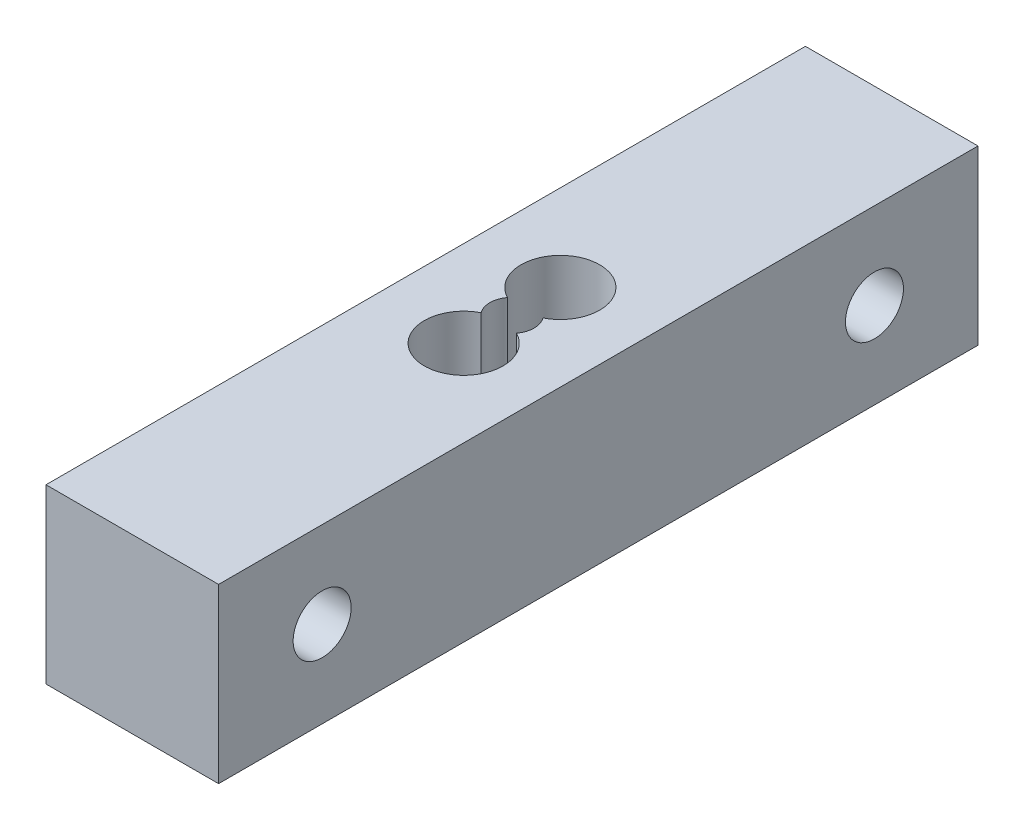
ISO-10303-21;
HEADER;
FILE_DESCRIPTION(('STEP AP214'),'2;1');
FILE_NAME('part.step','',(''),(''),'','','');
FILE_SCHEMA(('AUTOMOTIVE_DESIGN { 1 0 10303 214 1 1 1 1 }'));
ENDSEC;
DATA;
#1=APPLICATION_CONTEXT('core data for automotive mechanical design processes');
#2=APPLICATION_PROTOCOL_DEFINITION('international standard','automotive_design',2000,#1);
#3=PRODUCT_CONTEXT('',#1,'mechanical');
#4=PRODUCT('Part','Part','',(#3));
#5=PRODUCT_RELATED_PRODUCT_CATEGORY('part','',(#4));
#6=PRODUCT_DEFINITION_FORMATION('','',#4);
#7=PRODUCT_DEFINITION_CONTEXT('part definition',#1,'design');
#8=PRODUCT_DEFINITION('design','',#6,#7);
#9=PRODUCT_DEFINITION_SHAPE('','',#8);
#10=(LENGTH_UNIT() NAMED_UNIT(*) SI_UNIT(.MILLI.,.METRE.));
#11=(NAMED_UNIT(*) PLANE_ANGLE_UNIT() SI_UNIT($,.RADIAN.));
#12=(NAMED_UNIT(*) SI_UNIT($,.STERADIAN.) SOLID_ANGLE_UNIT());
#13=UNCERTAINTY_MEASURE_WITH_UNIT(LENGTH_MEASURE(1.E-05),#10,'distance_accuracy_value','');
#14=(GEOMETRIC_REPRESENTATION_CONTEXT(3) GLOBAL_UNCERTAINTY_ASSIGNED_CONTEXT((#13)) GLOBAL_UNIT_ASSIGNED_CONTEXT((#10,
#11,#12)) REPRESENTATION_CONTEXT('',''));
#15=CARTESIAN_POINT('',(0.,0.,0.));
#16=DIRECTION('',(0.,0.,1.));
#17=DIRECTION('',(1.,0.,0.));
#18=AXIS2_PLACEMENT_3D('',#15,#16,#17);
#19=CARTESIAN_POINT('',(6.25,6.25,27.5));
#20=DIRECTION('',(-1.,0.,0.));
#21=DIRECTION('',(0.,-1.,0.));
#22=AXIS2_PLACEMENT_3D('',#19,#20,#21);
#23=PLANE('',#22);
#24=CARTESIAN_POINT('',(6.25,0.,20.));
#25=DIRECTION('',(1.,0.,0.));
#26=DIRECTION('',(0.,0.,-1.));
#27=AXIS2_PLACEMENT_3D('',#24,#25,#26);
#28=CIRCLE('',#27,2.1);
#29=CARTESIAN_POINT('',(6.25,0.,17.9));
#30=VERTEX_POINT('',#29);
#31=EDGE_CURVE('E166',#30,#30,#28,.T.);
#32=ORIENTED_EDGE('',*,*,#31,.F.);
#33=EDGE_LOOP('',(#32));
#34=FACE_BOUND('',#33,.T.);
#35=CARTESIAN_POINT('',(6.25,0.,-20.));
#36=DIRECTION('',(1.,0.,0.));
#37=DIRECTION('',(0.,0.,-1.));
#38=AXIS2_PLACEMENT_3D('',#35,#36,#37);
#39=CIRCLE('',#38,2.1);
#40=CARTESIAN_POINT('',(6.25,0.,-22.1));
#41=VERTEX_POINT('',#40);
#42=EDGE_CURVE('E167',#41,#41,#39,.T.);
#43=ORIENTED_EDGE('',*,*,#42,.F.);
#44=EDGE_LOOP('',(#43));
#45=FACE_BOUND('',#44,.T.);
#46=DIRECTION('',(0.,1.,0.));
#47=VECTOR('',#46,1.);
#48=CARTESIAN_POINT('',(6.25,6.25,-27.5));
#49=LINE('',#48,#47);
#50=CARTESIAN_POINT('',(6.25,-6.25,-27.5));
#51=VERTEX_POINT('',#50);
#52=CARTESIAN_POINT('',(6.25,6.25,-27.5));
#53=VERTEX_POINT('',#52);
#54=EDGE_CURVE('E136',#51,#53,#49,.T.);
#55=ORIENTED_EDGE('',*,*,#54,.T.);
#56=DIRECTION('',(0.,0.,-1.));
#57=VECTOR('',#56,1.);
#58=CARTESIAN_POINT('',(6.25,6.25,27.5));
#59=LINE('',#58,#57);
#60=CARTESIAN_POINT('',(6.25,6.25,27.5));
#61=VERTEX_POINT('',#60);
#62=EDGE_CURVE('E152',#61,#53,#59,.T.);
#63=ORIENTED_EDGE('',*,*,#62,.F.);
#64=DIRECTION('',(0.,1.,0.));
#65=VECTOR('',#64,1.);
#66=CARTESIAN_POINT('',(6.25,6.25,27.5));
#67=LINE('',#66,#65);
#68=CARTESIAN_POINT('',(6.25,-6.25,27.5));
#69=VERTEX_POINT('',#68);
#70=EDGE_CURVE('E125',#69,#61,#67,.T.);
#71=ORIENTED_EDGE('',*,*,#70,.F.);
#72=DIRECTION('',(0.,0.,-1.));
#73=VECTOR('',#72,1.);
#74=CARTESIAN_POINT('',(6.25,-6.25,27.5));
#75=LINE('',#74,#73);
#76=EDGE_CURVE('E135',#69,#51,#75,.T.);
#77=ORIENTED_EDGE('',*,*,#76,.T.);
#78=EDGE_LOOP('',(#55,#63,#71,#77));
#79=FACE_BOUND('',#78,.T.);
#80=ADVANCED_FACE('F33',(#34,#45,#79),#23,.F.);
#81=CARTESIAN_POINT('',(-6.25,6.25,27.5));
#82=DIRECTION('',(0.,-1.,0.));
#83=DIRECTION('',(0.,0.,-1.));
#84=AXIS2_PLACEMENT_3D('',#81,#82,#83);
#85=PLANE('',#84);
#86=CARTESIAN_POINT('',(0.,6.25,-3.5));
#87=DIRECTION('',(0.,1.,0.));
#88=DIRECTION('',(0.,0.,1.));
#89=AXIS2_PLACEMENT_3D('',#86,#87,#88);
#90=CIRCLE('',#89,2.85);
#91=CARTESIAN_POINT('',(1.28346902167206,6.25,-0.955357142857141));
#92=VERTEX_POINT('',#91);
#93=CARTESIAN_POINT('',(-1.28346902167206,6.25,-0.955357142857144));
#94=VERTEX_POINT('',#93);
#95=EDGE_CURVE('E112',#92,#94,#90,.T.);
#96=ORIENTED_EDGE('',*,*,#95,.F.);
#97=CARTESIAN_POINT('',(0.,6.25,0.));
#98=DIRECTION('',(0.,1.,0.));
#99=DIRECTION('',(0.,0.,1.));
#100=AXIS2_PLACEMENT_3D('',#97,#98,#99);
#101=CIRCLE('',#100,1.6);
#102=CARTESIAN_POINT('',(1.28346902167206,6.25,0.955357142857141));
#103=VERTEX_POINT('',#102);
#104=EDGE_CURVE('E47',#103,#92,#101,.T.);
#105=ORIENTED_EDGE('',*,*,#104,.F.);
#106=CARTESIAN_POINT('',(0.,6.25,3.5));
#107=DIRECTION('',(0.,1.,0.));
#108=DIRECTION('',(0.,0.,1.));
#109=AXIS2_PLACEMENT_3D('',#106,#107,#108);
#110=CIRCLE('',#109,2.85);
#111=CARTESIAN_POINT('',(-1.28346902167206,6.25,0.955357142857144));
#112=VERTEX_POINT('',#111);
#113=EDGE_CURVE('E110',#112,#103,#110,.T.);
#114=ORIENTED_EDGE('',*,*,#113,.F.);
#115=EDGE_CURVE('E113',#94,#112,#101,.T.);
#116=ORIENTED_EDGE('',*,*,#115,.F.);
#117=EDGE_LOOP('',(#96,#105,#114,#116));
#118=FACE_BOUND('',#117,.T.);
#119=DIRECTION('',(-1.,0.,0.));
#120=VECTOR('',#119,1.);
#121=CARTESIAN_POINT('',(-6.25,6.25,-27.5));
#122=LINE('',#121,#120);
#123=CARTESIAN_POINT('',(-6.25,6.25,-27.5));
#124=VERTEX_POINT('',#123);
#125=EDGE_CURVE('E139',#53,#124,#122,.T.);
#126=ORIENTED_EDGE('',*,*,#125,.T.);
#127=DIRECTION('',(0.,0.,-1.));
#128=VECTOR('',#127,1.);
#129=CARTESIAN_POINT('',(-6.25,6.25,27.5));
#130=LINE('',#129,#128);
#131=CARTESIAN_POINT('',(-6.25,6.25,27.5));
#132=VERTEX_POINT('',#131);
#133=EDGE_CURVE('E149',#132,#124,#130,.T.);
#134=ORIENTED_EDGE('',*,*,#133,.F.);
#135=DIRECTION('',(-1.,0.,0.));
#136=VECTOR('',#135,1.);
#137=CARTESIAN_POINT('',(-6.25,6.25,27.5));
#138=LINE('',#137,#136);
#139=EDGE_CURVE('E128',#61,#132,#138,.T.);
#140=ORIENTED_EDGE('',*,*,#139,.F.);
#141=ORIENTED_EDGE('',*,*,#62,.T.);
#142=EDGE_LOOP('',(#126,#134,#140,#141));
#143=FACE_BOUND('',#142,.T.);
#144=ADVANCED_FACE('F107',(#118,#143),#85,.F.);
#145=CARTESIAN_POINT('',(-6.25,6.25,27.5));
#146=DIRECTION('',(1.,0.,0.));
#147=DIRECTION('',(0.,1.,0.));
#148=AXIS2_PLACEMENT_3D('',#145,#146,#147);
#149=PLANE('',#148);
#150=CARTESIAN_POINT('',(-6.25,0.,20.));
#151=DIRECTION('',(1.,0.,0.));
#152=DIRECTION('',(0.,0.,-1.));
#153=AXIS2_PLACEMENT_3D('',#150,#151,#152);
#154=CIRCLE('',#153,2.1);
#155=CARTESIAN_POINT('',(-6.25,0.,17.9));
#156=VERTEX_POINT('',#155);
#157=EDGE_CURVE('E170',#156,#156,#154,.T.);
#158=ORIENTED_EDGE('',*,*,#157,.T.);
#159=EDGE_LOOP('',(#158));
#160=FACE_BOUND('',#159,.T.);
#161=CARTESIAN_POINT('',(-6.25,0.,-20.));
#162=DIRECTION('',(1.,0.,0.));
#163=DIRECTION('',(0.,0.,-1.));
#164=AXIS2_PLACEMENT_3D('',#161,#162,#163);
#165=CIRCLE('',#164,2.1);
#166=CARTESIAN_POINT('',(-6.25,0.,-22.1));
#167=VERTEX_POINT('',#166);
#168=EDGE_CURVE('E163',#167,#167,#165,.T.);
#169=ORIENTED_EDGE('',*,*,#168,.T.);
#170=EDGE_LOOP('',(#169));
#171=FACE_BOUND('',#170,.T.);
#172=DIRECTION('',(0.,-1.,0.));
#173=VECTOR('',#172,1.);
#174=CARTESIAN_POINT('',(-6.25,6.25,-27.5));
#175=LINE('',#174,#173);
#176=CARTESIAN_POINT('',(-6.25,-6.25,-27.5));
#177=VERTEX_POINT('',#176);
#178=EDGE_CURVE('E141',#124,#177,#175,.T.);
#179=ORIENTED_EDGE('',*,*,#178,.T.);
#180=DIRECTION('',(0.,0.,-1.));
#181=VECTOR('',#180,1.);
#182=CARTESIAN_POINT('',(-6.25,-6.25,27.5));
#183=LINE('',#182,#181);
#184=CARTESIAN_POINT('',(-6.25,-6.25,27.5));
#185=VERTEX_POINT('',#184);
#186=EDGE_CURVE('E146',#185,#177,#183,.T.);
#187=ORIENTED_EDGE('',*,*,#186,.F.);
#188=DIRECTION('',(0.,-1.,0.));
#189=VECTOR('',#188,1.);
#190=CARTESIAN_POINT('',(-6.25,6.25,27.5));
#191=LINE('',#190,#189);
#192=EDGE_CURVE('E131',#132,#185,#191,.T.);
#193=ORIENTED_EDGE('',*,*,#192,.F.);
#194=ORIENTED_EDGE('',*,*,#133,.T.);
#195=EDGE_LOOP('',(#179,#187,#193,#194));
#196=FACE_BOUND('',#195,.T.);
#197=ADVANCED_FACE('F197',(#160,#171,#196),#149,.F.);
#198=CARTESIAN_POINT('',(-6.25,-6.25,27.5));
#199=DIRECTION('',(0.,1.,0.));
#200=DIRECTION('',(0.,0.,1.));
#201=AXIS2_PLACEMENT_3D('',#198,#199,#200);
#202=PLANE('',#201);
#203=CARTESIAN_POINT('',(0.,-6.25,3.5));
#204=DIRECTION('',(0.,1.,0.));
#205=DIRECTION('',(0.,0.,1.));
#206=AXIS2_PLACEMENT_3D('',#203,#204,#205);
#207=CIRCLE('',#206,2.85);
#208=CARTESIAN_POINT('',(-1.28346902167206,-6.25,0.955357142857144));
#209=VERTEX_POINT('',#208);
#210=CARTESIAN_POINT('',(1.28346902167206,-6.25,0.955357142857141));
#211=VERTEX_POINT('',#210);
#212=EDGE_CURVE('E117',#209,#211,#207,.T.);
#213=ORIENTED_EDGE('',*,*,#212,.T.);
#214=CARTESIAN_POINT('',(0.,-6.25,0.));
#215=DIRECTION('',(0.,1.,0.));
#216=DIRECTION('',(0.,0.,1.));
#217=AXIS2_PLACEMENT_3D('',#214,#215,#216);
#218=CIRCLE('',#217,1.6);
#219=CARTESIAN_POINT('',(1.28346902167206,-6.25,-0.955357142857141));
#220=VERTEX_POINT('',#219);
#221=EDGE_CURVE('E97',#211,#220,#218,.T.);
#222=ORIENTED_EDGE('',*,*,#221,.T.);
#223=CARTESIAN_POINT('',(0.,-6.25,-3.5));
#224=DIRECTION('',(0.,1.,0.));
#225=DIRECTION('',(0.,0.,1.));
#226=AXIS2_PLACEMENT_3D('',#223,#224,#225);
#227=CIRCLE('',#226,2.85);
#228=CARTESIAN_POINT('',(-1.28346902167206,-6.25,-0.955357142857144));
#229=VERTEX_POINT('',#228);
#230=EDGE_CURVE('E122',#220,#229,#227,.T.);
#231=ORIENTED_EDGE('',*,*,#230,.T.);
#232=EDGE_CURVE('E54',#229,#209,#218,.T.);
#233=ORIENTED_EDGE('',*,*,#232,.T.);
#234=EDGE_LOOP('',(#213,#222,#231,#233));
#235=FACE_BOUND('',#234,.T.);
#236=DIRECTION('',(1.,0.,0.));
#237=VECTOR('',#236,1.);
#238=CARTESIAN_POINT('',(-6.25,-6.25,-27.5));
#239=LINE('',#238,#237);
#240=EDGE_CURVE('E129',#177,#51,#239,.T.);
#241=ORIENTED_EDGE('',*,*,#240,.T.);
#242=ORIENTED_EDGE('',*,*,#76,.F.);
#243=DIRECTION('',(1.,0.,0.));
#244=VECTOR('',#243,1.);
#245=CARTESIAN_POINT('',(-6.25,-6.25,27.5));
#246=LINE('',#245,#244);
#247=EDGE_CURVE('E133',#185,#69,#246,.T.);
#248=ORIENTED_EDGE('',*,*,#247,.F.);
#249=ORIENTED_EDGE('',*,*,#186,.T.);
#250=EDGE_LOOP('',(#241,#242,#248,#249));
#251=FACE_BOUND('',#250,.T.);
#252=ADVANCED_FACE('F159',(#235,#251),#202,.F.);
#253=CARTESIAN_POINT('',(0.,0.,27.5));
#254=DIRECTION('',(0.,0.,1.));
#255=DIRECTION('',(1.,0.,0.));
#256=AXIS2_PLACEMENT_3D('',#253,#254,#255);
#257=PLANE('',#256);
#258=ORIENTED_EDGE('',*,*,#70,.T.);
#259=ORIENTED_EDGE('',*,*,#139,.T.);
#260=ORIENTED_EDGE('',*,*,#192,.T.);
#261=ORIENTED_EDGE('',*,*,#247,.T.);
#262=EDGE_LOOP('',(#258,#259,#260,#261));
#263=FACE_BOUND('',#262,.T.);
#264=ADVANCED_FACE('F193',(#263),#257,.T.);
#265=CARTESIAN_POINT('',(0.,0.,-27.5));
#266=DIRECTION('',(0.,0.,1.));
#267=DIRECTION('',(1.,0.,0.));
#268=AXIS2_PLACEMENT_3D('',#265,#266,#267);
#269=PLANE('',#268);
#270=ORIENTED_EDGE('',*,*,#54,.F.);
#271=ORIENTED_EDGE('',*,*,#240,.F.);
#272=ORIENTED_EDGE('',*,*,#178,.F.);
#273=ORIENTED_EDGE('',*,*,#125,.F.);
#274=EDGE_LOOP('',(#270,#271,#272,#273));
#275=FACE_BOUND('',#274,.T.);
#276=ADVANCED_FACE('F188',(#275),#269,.F.);
#277=CARTESIAN_POINT('',(0.,-6.25,3.5));
#278=DIRECTION('',(0.,1.,0.));
#279=DIRECTION('',(0.,0.,1.));
#280=AXIS2_PLACEMENT_3D('',#277,#278,#279);
#281=CYLINDRICAL_SURFACE('',#280,2.85);
#282=ORIENTED_EDGE('',*,*,#212,.F.);
#283=DIRECTION('',(0.,1.,0.));
#284=VECTOR('',#283,1.);
#285=CARTESIAN_POINT('',(-1.28346902167206,0.,0.955357142857144));
#286=LINE('',#285,#284);
#287=EDGE_CURVE('E102',#209,#112,#286,.T.);
#288=ORIENTED_EDGE('',*,*,#287,.T.);
#289=ORIENTED_EDGE('',*,*,#113,.T.);
#290=DIRECTION('',(0.,1.,0.));
#291=VECTOR('',#290,1.);
#292=CARTESIAN_POINT('',(1.28346902167206,0.,0.955357142857141));
#293=LINE('',#292,#291);
#294=EDGE_CURVE('E94',#103,#211,#293,.F.);
#295=ORIENTED_EDGE('',*,*,#294,.T.);
#296=EDGE_LOOP('',(#282,#288,#289,#295));
#297=FACE_BOUND('',#296,.T.);
#298=ADVANCED_FACE('F116',(#297),#281,.F.);
#299=CARTESIAN_POINT('',(0.,-6.25,-3.5));
#300=DIRECTION('',(0.,1.,0.));
#301=DIRECTION('',(0.,0.,1.));
#302=AXIS2_PLACEMENT_3D('',#299,#300,#301);
#303=CYLINDRICAL_SURFACE('',#302,2.85);
#304=ORIENTED_EDGE('',*,*,#230,.F.);
#305=DIRECTION('',(0.,1.,0.));
#306=VECTOR('',#305,1.);
#307=CARTESIAN_POINT('',(1.28346902167206,0.,-0.955357142857141));
#308=LINE('',#307,#306);
#309=EDGE_CURVE('E11',#220,#92,#308,.T.);
#310=ORIENTED_EDGE('',*,*,#309,.T.);
#311=ORIENTED_EDGE('',*,*,#95,.T.);
#312=DIRECTION('',(0.,1.,0.));
#313=VECTOR('',#312,1.);
#314=CARTESIAN_POINT('',(-1.28346902167206,0.,-0.955357142857144));
#315=LINE('',#314,#313);
#316=EDGE_CURVE('E40',#94,#229,#315,.F.);
#317=ORIENTED_EDGE('',*,*,#316,.T.);
#318=EDGE_LOOP('',(#304,#310,#311,#317));
#319=FACE_BOUND('',#318,.T.);
#320=ADVANCED_FACE('F157',(#319),#303,.F.);
#321=CARTESIAN_POINT('',(0.,-6.25,0.));
#322=DIRECTION('',(0.,1.,0.));
#323=DIRECTION('',(0.,0.,1.));
#324=AXIS2_PLACEMENT_3D('',#321,#322,#323);
#325=CYLINDRICAL_SURFACE('',#324,1.6);
#326=ORIENTED_EDGE('',*,*,#232,.F.);
#327=ORIENTED_EDGE('',*,*,#316,.F.);
#328=ORIENTED_EDGE('',*,*,#115,.T.);
#329=ORIENTED_EDGE('',*,*,#287,.F.);
#330=EDGE_LOOP('',(#326,#327,#328,#329));
#331=FACE_BOUND('',#330,.T.);
#332=ADVANCED_FACE('F216',(#331),#325,.F.);
#333=ORIENTED_EDGE('',*,*,#104,.T.);
#334=ORIENTED_EDGE('',*,*,#309,.F.);
#335=ORIENTED_EDGE('',*,*,#221,.F.);
#336=ORIENTED_EDGE('',*,*,#294,.F.);
#337=EDGE_LOOP('',(#333,#334,#335,#336));
#338=FACE_BOUND('',#337,.T.);
#339=ADVANCED_FACE('F95',(#338),#325,.F.);
#340=CARTESIAN_POINT('',(-6.25,0.,-20.));
#341=DIRECTION('',(1.,0.,0.));
#342=DIRECTION('',(0.,0.,-1.));
#343=AXIS2_PLACEMENT_3D('',#340,#341,#342);
#344=CYLINDRICAL_SURFACE('',#343,2.1);
#345=ORIENTED_EDGE('',*,*,#168,.F.);
#346=EDGE_LOOP('',(#345));
#347=FACE_BOUND('',#346,.T.);
#348=ORIENTED_EDGE('',*,*,#42,.T.);
#349=EDGE_LOOP('',(#348));
#350=FACE_BOUND('',#349,.T.);
#351=ADVANCED_FACE('F219',(#347,#350),#344,.F.);
#352=CARTESIAN_POINT('',(-6.25,0.,20.));
#353=DIRECTION('',(1.,0.,0.));
#354=DIRECTION('',(0.,0.,-1.));
#355=AXIS2_PLACEMENT_3D('',#352,#353,#354);
#356=CYLINDRICAL_SURFACE('',#355,2.1);
#357=ORIENTED_EDGE('',*,*,#157,.F.);
#358=EDGE_LOOP('',(#357));
#359=FACE_BOUND('',#358,.T.);
#360=ORIENTED_EDGE('',*,*,#31,.T.);
#361=EDGE_LOOP('',(#360));
#362=FACE_BOUND('',#361,.T.);
#363=ADVANCED_FACE('F176',(#359,#362),#356,.F.);
#364=CLOSED_SHELL('',(#80,#144,#197,#252,#264,#276,#298,#320,#332,#339,#351,#363));
#365=MANIFOLD_SOLID_BREP('B2',#364);
#366=ADVANCED_BREP_SHAPE_REPRESENTATION('',(#18,#365),#14);
#367=SHAPE_DEFINITION_REPRESENTATION(#9,#366);
ENDSEC;
END-ISO-10303-21;
